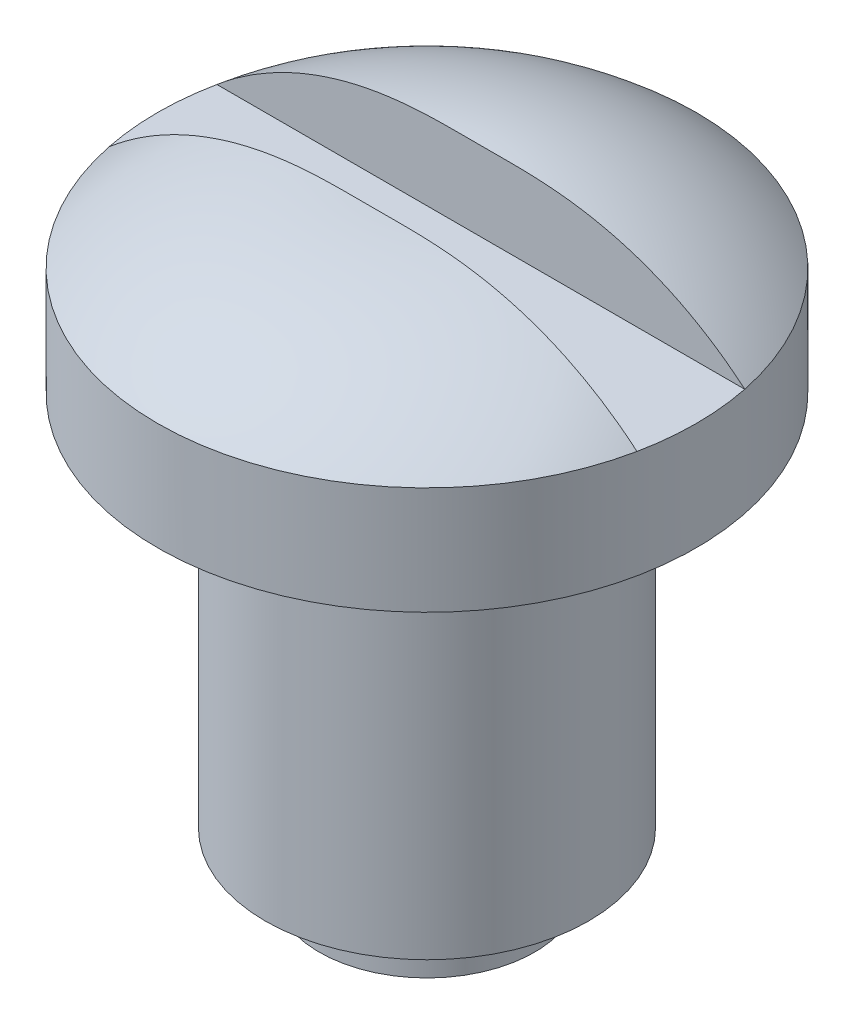
ISO-10303-21;
HEADER;
FILE_DESCRIPTION(('STEP AP214'),'2;1');
FILE_NAME('part.step','',(''),(''),'','','');
FILE_SCHEMA(('AUTOMOTIVE_DESIGN { 1 0 10303 214 1 1 1 1 }'));
ENDSEC;
DATA;
#1=APPLICATION_CONTEXT('core data for automotive mechanical design processes');
#2=APPLICATION_PROTOCOL_DEFINITION('international standard','automotive_design',2000,#1);
#3=PRODUCT_CONTEXT('',#1,'mechanical');
#4=PRODUCT('Part','Part','',(#3));
#5=PRODUCT_RELATED_PRODUCT_CATEGORY('part','',(#4));
#6=PRODUCT_DEFINITION_FORMATION('','',#4);
#7=PRODUCT_DEFINITION_CONTEXT('part definition',#1,'design');
#8=PRODUCT_DEFINITION('design','',#6,#7);
#9=PRODUCT_DEFINITION_SHAPE('','',#8);
#10=(LENGTH_UNIT() NAMED_UNIT(*) SI_UNIT(.MILLI.,.METRE.));
#11=(NAMED_UNIT(*) PLANE_ANGLE_UNIT() SI_UNIT($,.RADIAN.));
#12=(NAMED_UNIT(*) SI_UNIT($,.STERADIAN.) SOLID_ANGLE_UNIT());
#13=UNCERTAINTY_MEASURE_WITH_UNIT(LENGTH_MEASURE(1.E-05),#10,'distance_accuracy_value','');
#14=(GEOMETRIC_REPRESENTATION_CONTEXT(3) GLOBAL_UNCERTAINTY_ASSIGNED_CONTEXT((#13)) GLOBAL_UNIT_ASSIGNED_CONTEXT((#10,
#11,#12)) REPRESENTATION_CONTEXT('',''));
#15=CARTESIAN_POINT('',(0.,0.,0.));
#16=DIRECTION('',(0.,0.,1.));
#17=DIRECTION('',(1.,0.,0.));
#18=AXIS2_PLACEMENT_3D('',#15,#16,#17);
#19=CARTESIAN_POINT('',(0.,1.10246466043971,0.));
#20=DIRECTION('',(0.,1.,0.));
#21=DIRECTION('',(-1.,0.,0.));
#22=AXIS2_PLACEMENT_3D('',#19,#20,#21);
#23=DEGENERATE_TOROIDAL_SURFACE('',#22,1.06727044373896,6.,.T.);
#24=CARTESIAN_POINT('',(0.,5.63387042877594,0.));
#25=DIRECTION('',(0.,1.,0.));
#26=DIRECTION('',(-1.,0.,0.));
#27=AXIS2_PLACEMENT_3D('',#24,#25,#26);
#28=CIRCLE('',#27,5.);
#29=CARTESIAN_POINT('',(-4.89897948556636,5.63387042877594,1.));
#30=VERTEX_POINT('',#29);
#31=CARTESIAN_POINT('',(4.89897948556636,5.63387042877594,1.));
#32=VERTEX_POINT('',#31);
#33=EDGE_CURVE('E72',#30,#32,#28,.T.);
#34=ORIENTED_EDGE('',*,*,#33,.T.);
#35=CARTESIAN_POINT('',(0.,7.1020875392046,1.));
#36=CARTESIAN_POINT('',(0.0834064557707305,7.10208272184523,1.));
#37=CARTESIAN_POINT('',(0.166813050562348,7.10223281939137,1.));
#38=CARTESIAN_POINT('',(0.333613790474369,7.10247516006334,1.));
#39=CARTESIAN_POINT('',(0.417007935582582,7.1025674118777,1.));
#40=CARTESIAN_POINT('',(0.583694002555676,7.10192975363839,1.));
#41=CARTESIAN_POINT('',(0.666985924864176,7.10120084765964,1.));
#42=CARTESIAN_POINT('',(0.83354295706955,7.09815249309468,1.));
#43=CARTESIAN_POINT('',(0.916808067495282,7.09583307808283,1.));
#44=CARTESIAN_POINT('',(1.08441095459764,7.08896792534127,1.));
#45=CARTESIAN_POINT('',(1.16874756320231,7.0843917064364,1.));
#46=CARTESIAN_POINT('',(1.33723448548417,7.07258642105396,1.));
#47=CARTESIAN_POINT('',(1.42138479712311,7.06535732569473,1.));
#48=CARTESIAN_POINT('',(1.67338135985405,7.03925953198136,1.));
#49=CARTESIAN_POINT('',(1.84080316048928,7.01597932970922,1.));
#50=CARTESIAN_POINT('',(2.17342793448257,6.95653075919735,1.));
#51=CARTESIAN_POINT('',(2.33862992810946,6.92035688233348,1.));
#52=CARTESIAN_POINT('',(2.66562199457182,6.83480020021067,1.));
#53=CARTESIAN_POINT('',(2.82741133997188,6.78541460885244,1.));
#54=CARTESIAN_POINT('',(3.16933319106205,6.66541270211304,1.));
#55=CARTESIAN_POINT('',(3.34875748783476,6.59276452487831,1.));
#56=CARTESIAN_POINT('',(3.69986381140192,6.43065319791297,1.));
#57=CARTESIAN_POINT('',(3.8715449975273,6.34118822780715,1.));
#58=CARTESIAN_POINT('',(4.20570500899139,6.14603401854488,1.));
#59=CARTESIAN_POINT('',(4.36817253892713,6.04032543018806,1.));
#60=CARTESIAN_POINT('',(4.68210108491048,5.81368729626758,1.));
#61=CARTESIAN_POINT('',(4.83356349953238,5.69275969015315,1.));
#62=CARTESIAN_POINT('',(5.10616780067026,5.45252945787583,1.));
#63=CARTESIAN_POINT('',(5.22874827866797,5.33485386926348,1.));
#64=CARTESIAN_POINT('',(5.46347008819724,5.08943253022652,1.));
#65=CARTESIAN_POINT('',(5.57560802871921,4.9616835333579,1.));
#66=CARTESIAN_POINT('',(5.78842770053341,4.69723985008136,1.));
#67=CARTESIAN_POINT('',(5.88912354524845,4.56055651917853,1.));
#68=CARTESIAN_POINT('',(6.07851158361741,4.27903802092303,1.));
#69=CARTESIAN_POINT('',(6.16719937706766,4.13419989272224,1.));
#70=CARTESIAN_POINT('',(6.33081368530602,3.83937678695172,1.));
#71=CARTESIAN_POINT('',(6.40590202756893,3.68948158409317,1.));
#72=CARTESIAN_POINT('',(6.54318132174574,3.38383038134429,1.));
#73=CARTESIAN_POINT('',(6.60536754854852,3.22807225887593,1.));
#74=CARTESIAN_POINT('',(6.71634631953301,2.91189329747483,1.));
#75=CARTESIAN_POINT('',(6.7651417494366,2.75147347139462,1.));
#76=CARTESIAN_POINT('',(6.84901991932449,2.42702477233666,1.));
#77=CARTESIAN_POINT('',(6.88409761224459,2.26299459443058,1.));
#78=CARTESIAN_POINT('',(6.94017279887664,1.93307682401257,1.));
#79=CARTESIAN_POINT('',(6.96121427538016,1.76719670540409,1.));
#80=CARTESIAN_POINT('',(6.98924738394379,1.43419529162845,1.));
#81=CARTESIAN_POINT('',(6.99623413827782,1.26707358575478,1.));
#82=CARTESIAN_POINT('',(6.99609292276324,0.932849560999366,1.));
#83=CARTESIAN_POINT('',(6.98896608053519,0.765747241635463,1.));
#84=CARTESIAN_POINT('',(6.96065113952161,0.432738195285757,1.));
#85=CARTESIAN_POINT('',(6.93946304055133,0.266831468315663,1.));
#86=CARTESIAN_POINT('',(6.88318477051579,-0.0625647472183489,1.));
#87=CARTESIAN_POINT('',(6.84809804036746,-0.226054823693966,1.));
#88=CARTESIAN_POINT('',(6.76428897225685,-0.549441028176385,1.));
#89=CARTESIAN_POINT('',(6.71557137885631,-0.709338385834929,1.));
#90=CARTESIAN_POINT('',(6.60485390002731,-1.02443776890092,1.));
#91=CARTESIAN_POINT('',(6.54285612977677,-1.17964053754397,1.));
#92=CARTESIAN_POINT('',(6.40604361249863,-1.48422157046659,1.));
#93=CARTESIAN_POINT('',(6.33123356972273,-1.63360194791474,1.));
#94=CARTESIAN_POINT('',(6.16929054873599,-1.92559053577235,1.));
#95=CARTESIAN_POINT('',(6.08215354261695,-2.06819651217959,1.));
#96=CARTESIAN_POINT('',(5.89623430250709,-2.34552770586269,1.));
#97=CARTESIAN_POINT('',(5.79745633021479,-2.48025578033902,1.));
#98=CARTESIAN_POINT('',(5.58872910101907,-2.74120347756172,1.));
#99=CARTESIAN_POINT('',(5.47875790939337,-2.86740555518401,1.));
#100=CARTESIAN_POINT('',(5.24864242949182,-3.11007850417937,1.));
#101=CARTESIAN_POINT('',(5.12850183316016,-3.2265528768897,1.));
#102=CARTESIAN_POINT('',(4.87837411943098,-3.44946461086788,1.));
#103=CARTESIAN_POINT('',(4.74834930097376,-3.55585966746264,1.));
#104=CARTESIAN_POINT('',(4.47987162785239,-3.75731533967046,1.));
#105=CARTESIAN_POINT('',(4.34142182210249,-3.85238001921165,1.));
#106=CARTESIAN_POINT('',(4.05764920166803,-4.03021798407122,1.));
#107=CARTESIAN_POINT('',(3.91235750104673,-4.11304093749308,1.));
#108=CARTESIAN_POINT('',(3.61539683554561,-4.26636412587088,1.));
#109=CARTESIAN_POINT('',(3.46372731388388,-4.33686328218079,1.));
#110=CARTESIAN_POINT('',(3.15403351286376,-4.46560231188326,1.));
#111=CARTESIAN_POINT('',(2.99597217434372,-4.5237528918419,1.));
#112=CARTESIAN_POINT('',(2.67564457785104,-4.6269514505552,1.));
#113=CARTESIAN_POINT('',(2.51337900049744,-4.67200153587602,1.));
#114=CARTESIAN_POINT('',(2.26715039194015,-4.72993435895696,1.));
#115=CARTESIAN_POINT('',(2.1843000510808,-4.74768438701457,1.));
#116=CARTESIAN_POINT('',(2.01795983952187,-4.77993587778114,1.));
#117=CARTESIAN_POINT('',(1.934469930054,-4.79443714192443,1.));
#118=CARTESIAN_POINT('',(1.76701964127145,-4.82027148628442,1.));
#119=CARTESIAN_POINT('',(1.6830593472316,-4.8316051229305,1.));
#120=CARTESIAN_POINT('',(1.51480145225322,-4.85125141917102,1.));
#121=CARTESIAN_POINT('',(1.43050390808286,-4.8595645672124,1.));
#122=CARTESIAN_POINT('',(1.27294174447047,-4.87248256916165,1.));
#123=CARTESIAN_POINT('',(1.19970495904461,-4.87743410785132,1.));
#124=CARTESIAN_POINT('',(1.0531286526334,-4.88547504648556,1.));
#125=CARTESIAN_POINT('',(0.979789128254282,-4.88856438338931,1.));
#126=CARTESIAN_POINT('',(0.833034316076206,-4.89320828077426,1.));
#127=CARTESIAN_POINT('',(0.75961900956049,-4.8947622132264,1.));
#128=CARTESIAN_POINT('',(0.612775101066562,-4.89677848687765,1.));
#129=CARTESIAN_POINT('',(0.539346498954059,-4.89724081635609,1.));
#130=CARTESIAN_POINT('',(0.392309412918296,-4.89761500465705,1.));
#131=CARTESIAN_POINT('',(0.318700928954407,-4.89752551231366,1.));
#132=CARTESIAN_POINT('',(0.17148546994651,-4.89730862061728,1.));
#133=CARTESIAN_POINT('',(0.0978784949004949,-4.89718122198718,1.));
#134=CARTESIAN_POINT('',(-0.0493310835012094,-4.89714180580704,1.));
#135=CARTESIAN_POINT('',(-0.122933686850261,-4.89722977514643,1.));
#136=CARTESIAN_POINT('',(-0.270140262042322,-4.89745465383858,1.));
#137=CARTESIAN_POINT('',(-0.343744233881473,-4.89759156422296,1.));
#138=CARTESIAN_POINT('',(-0.490561297694793,-4.89743511265031,1.));
#139=CARTESIAN_POINT('',(-0.56377438628018,-4.89714403553991,1.));
#140=CARTESIAN_POINT('',(-0.710190888463883,-4.89559111328247,1.));
#141=CARTESIAN_POINT('',(-0.783394302227771,-4.89432928774678,1.));
#142=CARTESIAN_POINT('',(-0.929751396771713,-4.89036714999057,1.));
#143=CARTESIAN_POINT('',(-1.00290508447176,-4.88766711870483,1.));
#144=CARTESIAN_POINT('',(-1.14912429872804,-4.88048258089455,1.));
#145=CARTESIAN_POINT('',(-1.22218982508005,-4.87599807024397,1.));
#146=CARTESIAN_POINT('',(-1.44062673318779,-4.85951745518037,1.));
#147=CARTESIAN_POINT('',(-1.58578936109009,-4.84448356362797,1.));
#148=CARTESIAN_POINT('',(-1.87486995170644,-4.80517164457572,1.));
#149=CARTESIAN_POINT('',(-2.0187878654679,-4.78089325518035,1.));
#150=CARTESIAN_POINT('',(-2.32917386464546,-4.71763440542215,1.));
#151=CARTESIAN_POINT('',(-2.49527917156747,-4.67684729223116,1.));
#152=CARTESIAN_POINT('',(-2.82384520194434,-4.5816680739705,1.));
#153=CARTESIAN_POINT('',(-2.98629949024427,-4.52725373014414,1.));
#154=CARTESIAN_POINT('',(-3.30575196462401,-4.40511624910536,1.));
#155=CARTESIAN_POINT('',(-3.4627606216932,-4.33742053517782,1.));
#156=CARTESIAN_POINT('',(-3.7703980381138,-4.18904230973254,1.));
#157=CARTESIAN_POINT('',(-3.92103074565678,-4.10836798810111,1.));
#158=CARTESIAN_POINT('',(-4.21511935605219,-3.93437103186997,1.));
#159=CARTESIAN_POINT('',(-4.35856391457772,-3.84102921601775,1.));
#160=CARTESIAN_POINT('',(-4.63698130530766,-3.64240179292858,1.));
#161=CARTESIAN_POINT('',(-4.77195221036444,-3.5371134838974,1.));
#162=CARTESIAN_POINT('',(-5.03257220401592,-3.31518174362788,1.));
#163=CARTESIAN_POINT('',(-5.1582065979867,-3.19852105376033,1.));
#164=CARTESIAN_POINT('',(-5.39896529121806,-2.95483370618898,1.));
#165=CARTESIAN_POINT('',(-5.51409045593652,-2.82780790370936,1.));
#166=CARTESIAN_POINT('',(-5.73102510458367,-2.56665778769994,1.));
#167=CARTESIAN_POINT('',(-5.83303495429258,-2.43269985136781,1.));
#168=CARTESIAN_POINT('',(-6.0253807455025,-2.15657562376302,1.));
#169=CARTESIAN_POINT('',(-6.11571241229456,-2.01440635418919,1.));
#170=CARTESIAN_POINT('',(-6.28390605517976,-1.72308334813499,1.));
#171=CARTESIAN_POINT('',(-6.36178168710172,-1.57393749542023,1.));
#172=CARTESIAN_POINT('',(-6.50464397034856,-1.26952784800976,1.));
#173=CARTESIAN_POINT('',(-6.56962586781361,-1.11426182203103,1.));
#174=CARTESIAN_POINT('',(-6.6858673404774,-0.79965800263614,1.));
#175=CARTESIAN_POINT('',(-6.73720125260953,-0.640347670225266,1.));
#176=CARTESIAN_POINT('',(-6.82626732910097,-0.317905542591905,1.));
#177=CARTESIAN_POINT('',(-6.86399447799251,-0.154772361811058,1.));
#178=CARTESIAN_POINT('',(-6.92554315212827,0.174065520642543,1.));
#179=CARTESIAN_POINT('',(-6.949367216622,0.339769747062371,1.));
#180=CARTESIAN_POINT('',(-6.9829552816151,0.67265994615952,1.));
#181=CARTESIAN_POINT('',(-6.99271401940733,0.83984644991974,1.));
#182=CARTESIAN_POINT('',(-6.99807886683044,1.17410496901916,1.));
#183=CARTESIAN_POINT('',(-6.99371379607232,1.34117652259928,1.));
#184=CARTESIAN_POINT('',(-6.97092034505352,1.6744336382895,1.));
#185=CARTESIAN_POINT('',(-6.95248560194383,1.84061876527248,1.));
#186=CARTESIAN_POINT('',(-6.90167583741585,2.1708556014794,1.));
#187=CARTESIAN_POINT('',(-6.86929987016396,2.33490716517498,1.));
#188=CARTESIAN_POINT('',(-6.79085777712036,2.65962525802465,1.));
#189=CARTESIAN_POINT('',(-6.74479784905352,2.82029328444316,1.));
#190=CARTESIAN_POINT('',(-6.63928555472313,3.13726249047386,1.));
#191=CARTESIAN_POINT('',(-6.57982626132004,3.29356136419568,1.));
#192=CARTESIAN_POINT('',(-6.44798044434751,3.60053879799335,1.));
#193=CARTESIAN_POINT('',(-6.37559875176592,3.75121943306472,1.));
#194=CARTESIAN_POINT('',(-6.21842151048038,4.045938753312,1.));
#195=CARTESIAN_POINT('',(-6.13362735963036,4.18997818400171,1.));
#196=CARTESIAN_POINT('',(-5.95226097395288,4.47036513655283,1.));
#197=CARTESIAN_POINT('',(-5.85569306515447,4.6067154568514,1.));
#198=CARTESIAN_POINT('',(-5.65134664421551,4.87095337844092,1.));
#199=CARTESIAN_POINT('',(-5.54355722294981,4.99883254305611,1.));
#200=CARTESIAN_POINT('',(-5.3176619547604,5.24504244332802,1.));
#201=CARTESIAN_POINT('',(-5.19955986168378,5.36337662346663,1.));
#202=CARTESIAN_POINT('',(-4.95361897679406,5.58994555321354,1.));
#203=CARTESIAN_POINT('',(-4.82576204522577,5.69816061131528,1.));
#204=CARTESIAN_POINT('',(-4.56147871986629,5.90345964245239,1.));
#205=CARTESIAN_POINT('',(-4.42505539380045,6.00054756545111,1.));
#206=CARTESIAN_POINT('',(-4.14380029213791,6.18349990783393,1.));
#207=CARTESIAN_POINT('',(-3.99892603385962,6.26929901416298,1.));
#208=CARTESIAN_POINT('',(-3.7025208194815,6.42849051361529,1.));
#209=CARTESIAN_POINT('',(-3.55098996434505,6.5018830948317,1.));
#210=CARTESIAN_POINT('',(-3.24302109338905,6.63556426822048,1.));
#211=CARTESIAN_POINT('',(-3.08660668407954,6.69590725499664,1.));
#212=CARTESIAN_POINT('',(-2.76938749628865,6.80364919736307,1.));
#213=CARTESIAN_POINT('',(-2.60858236458466,6.85104710815964,1.));
#214=CARTESIAN_POINT('',(-2.24752685598251,6.94196789974219,1.));
#215=CARTESIAN_POINT('',(-2.04645869514569,6.98228370784214,1.));
#216=CARTESIAN_POINT('',(-1.74283926362059,7.02882872972167,1.));
#217=CARTESIAN_POINT('',(-1.6412878025781,7.04202282208212,1.));
#218=CARTESIAN_POINT('',(-1.43771442273999,7.06406666620214,1.));
#219=CARTESIAN_POINT('',(-1.33569252883355,7.07291664519285,1.));
#220=CARTESIAN_POINT('',(-1.13095848454759,7.08676981909807,1.));
#221=CARTESIAN_POINT('',(-1.02824525151414,7.09175632887864,1.));
#222=CARTESIAN_POINT('',(-0.822716521390734,7.09863351236529,1.));
#223=CARTESIAN_POINT('',(-0.719901016563188,7.10052393063437,1.));
#224=CARTESIAN_POINT('',(-0.51423519360891,7.10246869540313,1.));
#225=CARTESIAN_POINT('',(-0.411384873318856,7.10252257063907,1.));
#226=CARTESIAN_POINT('',(-0.205689772517381,7.10233495692986,1.));
#227=CARTESIAN_POINT('',(-0.102844991944583,7.1020934792878,1.));
#228=CARTESIAN_POINT('',(0.,7.1020875392046,1.));
#229=B_SPLINE_CURVE_WITH_KNOTS('',3,(#35,#36,#37,#38,#39,#40,#41,#42,#43,#44,#45,#46,#47,#48,
#49,#50,#51,#52,#53,#54,#55,#56,#57,#58,#59,#60,#61,#62,#63,#64,#65,#66,#67,#68,#69,#70,#71,#72,
#73,#74,#75,#76,#77,#78,#79,#80,#81,#82,#83,#84,#85,#86,#87,#88,#89,#90,#91,#92,#93,#94,#95,#96,
#97,#98,#99,#100,#101,#102,#103,#104,#105,#106,#107,#108,#109,#110,#111,#112,#113,#114,#115,
#116,#117,#118,#119,#120,#121,#122,#123,#124,#125,#126,#127,#128,#129,#130,#131,#132,#133,#134,
#135,#136,#137,#138,#139,#140,#141,#142,#143,#144,#145,#146,#147,#148,#149,#150,#151,#152,#153,
#154,#155,#156,#157,#158,#159,#160,#161,#162,#163,#164,#165,#166,#167,#168,#169,#170,#171,#172,
#173,#174,#175,#176,#177,#178,#179,#180,#181,#182,#183,#184,#185,#186,#187,#188,#189,#190,#191,
#192,#193,#194,#195,#196,#197,#198,#199,#200,#201,#202,#203,#204,#205,#206,#207,#208,#209,#210,
#211,#212,#213,#214,#215,#216,#217,#218,#219,#220,#221,#222,#223,#224,#225,#226,#227,#228),
.UNSPECIFIED.,.T.,.F.,(4,2,2,2,2,2,2,2,2,2,2,2,2,2,2,2,2,2,2,2,2,2,2,2,2,2,2,2,2,2,2,2,2,2,2,2,
2,2,2,2,2,2,2,2,2,2,2,2,2,2,2,2,2,2,2,2,2,2,2,2,2,2,2,2,2,2,2,2,2,2,2,2,2,2,2,2,2,2,2,2,2,2,2,2,
2,2,2,2,2,2,2,2,2,2,2,2,4),(0.,0.25021982780834,0.500402063149061,0.7502787185956,
1.00015009951085,1.25349277668957,1.5068382120719,2.0134394518421,2.52025738914066,
3.02718228906713,3.60701025628497,4.1869010245933,4.76748798445208,5.34800103146572,
5.85716473944914,6.36649321598098,6.87518647307086,7.38406563299907,7.88642167379757,
8.38896136776653,8.8913926790426,9.39400867258204,9.89504221551941,10.3962496134083,
10.8974169684237,11.3985843300241,11.8996276939058,12.4004968736534,12.9012863375402,
13.4018923204102,13.9026622587009,14.4032494338611,14.9048371917941,15.4062436258272,
15.9096690771316,16.4129134151982,16.914056333074,17.4152430917773,17.919939065653,
18.4245538392277,18.6786916565942,18.9328450027236,19.1869536758594,19.4410212384593,
19.6612071864842,19.8814005880099,20.1016840183727,20.3219698139328,20.5427952051389,
20.7636163852852,20.9844241232322,21.2052365158159,21.4248743550261,21.6445077571629,
21.8640982724971,22.0836892955691,22.5212203689935,22.9587685722623,23.4713103028264,
23.9846939818503,24.4970285788864,25.0090411366534,25.5218378244031,26.0347507172241,
26.548454492966,27.0621159258478,27.5666440512835,28.0713563355915,28.5755114427125,
29.0798520854846,29.581386668168,30.0831059285651,30.5847335266097,31.0865487658293,
31.5873406980163,32.0883592419449,32.589411782519,33.0902377319857,33.5913231924428,
34.0922217148603,34.5930638709208,35.0937225541365,35.5948725859664,36.0958409519422,
36.597764738314,37.0995097938755,37.6040408421131,38.1085642405577,38.6109422703299,
39.113360834927,39.7275350409815,40.0346747686854,40.3417984288636,40.6502411805076,
40.9587093783398,41.267256729661,41.5757922733131),.UNSPECIFIED.);
#230=EDGE_CURVE('E80',#30,#32,#229,.T.);
#231=ORIENTED_EDGE('',*,*,#230,.F.);
#232=EDGE_LOOP('',(#34,#231));
#233=FACE_BOUND('',#232,.T.);
#234=ADVANCED_FACE('F38',(#233),#23,.T.);
#235=CARTESIAN_POINT('',(0.,6.1020875392046,0.));
#236=DIRECTION('',(0.,1.,0.));
#237=DIRECTION('',(-1.,0.,0.));
#238=AXIS2_PLACEMENT_3D('',#235,#236,#237);
#239=CYLINDRICAL_SURFACE('',#238,3.);
#240=CARTESIAN_POINT('',(0.,-3.36612957122406,0.));
#241=DIRECTION('',(0.,1.,0.));
#242=DIRECTION('',(-1.,0.,0.));
#243=AXIS2_PLACEMENT_3D('',#240,#241,#242);
#244=CIRCLE('',#243,3.);
#245=CARTESIAN_POINT('',(-3.,-3.36612957122406,0.));
#246=VERTEX_POINT('',#245);
#247=EDGE_CURVE('E141',#246,#246,#244,.T.);
#248=ORIENTED_EDGE('',*,*,#247,.T.);
#249=EDGE_LOOP('',(#248));
#250=FACE_BOUND('',#249,.T.);
#251=CARTESIAN_POINT('',(0.,3.63387042877594,0.));
#252=DIRECTION('',(0.,1.,0.));
#253=DIRECTION('',(-1.,0.,0.));
#254=AXIS2_PLACEMENT_3D('',#251,#252,#253);
#255=CIRCLE('',#254,3.);
#256=CARTESIAN_POINT('',(-3.,3.63387042877594,0.));
#257=VERTEX_POINT('',#256);
#258=EDGE_CURVE('E11',#257,#257,#255,.T.);
#259=ORIENTED_EDGE('',*,*,#258,.F.);
#260=EDGE_LOOP('',(#259));
#261=FACE_BOUND('',#260,.T.);
#262=ADVANCED_FACE('F40',(#250,#261),#239,.T.);
#263=CARTESIAN_POINT('',(-3.,3.63387042877594,0.));
#264=DIRECTION('',(0.,-1.,0.));
#265=DIRECTION('',(1.,0.,0.));
#266=AXIS2_PLACEMENT_3D('',#263,#264,#265);
#267=PLANE('',#266);
#268=ORIENTED_EDGE('',*,*,#258,.T.);
#269=EDGE_LOOP('',(#268));
#270=FACE_BOUND('',#269,.T.);
#271=CARTESIAN_POINT('',(0.,3.63387042877593,0.));
#272=DIRECTION('',(0.,1.,0.));
#273=DIRECTION('',(-1.,0.,0.));
#274=AXIS2_PLACEMENT_3D('',#271,#272,#273);
#275=CIRCLE('',#274,5.);
#276=CARTESIAN_POINT('',(-5.,3.63387042877594,0.));
#277=VERTEX_POINT('',#276);
#278=EDGE_CURVE('E46',#277,#277,#275,.T.);
#279=ORIENTED_EDGE('',*,*,#278,.F.);
#280=EDGE_LOOP('',(#279));
#281=FACE_BOUND('',#280,.T.);
#282=ADVANCED_FACE('F95',(#270,#281),#267,.T.);
#283=CARTESIAN_POINT('',(0.,6.1020875392046,0.));
#284=DIRECTION('',(0.,1.,0.));
#285=DIRECTION('',(-1.,0.,0.));
#286=AXIS2_PLACEMENT_3D('',#283,#284,#285);
#287=CYLINDRICAL_SURFACE('',#286,5.);
#288=ORIENTED_EDGE('',*,*,#278,.T.);
#289=EDGE_LOOP('',(#288));
#290=FACE_BOUND('',#289,.T.);
#291=CARTESIAN_POINT('',(-4.89897948556636,5.63387042877594,-1.));
#292=VERTEX_POINT('',#291);
#293=EDGE_CURVE('E58',#292,#30,#28,.T.);
#294=ORIENTED_EDGE('',*,*,#293,.F.);
#295=CARTESIAN_POINT('',(4.89897948556636,5.63387042877593,-1.));
#296=VERTEX_POINT('',#295);
#297=EDGE_CURVE('E70',#296,#292,#28,.T.);
#298=ORIENTED_EDGE('',*,*,#297,.F.);
#299=EDGE_CURVE('E53',#32,#296,#28,.T.);
#300=ORIENTED_EDGE('',*,*,#299,.F.);
#301=ORIENTED_EDGE('',*,*,#33,.F.);
#302=EDGE_LOOP('',(#294,#298,#300,#301));
#303=FACE_BOUND('',#302,.T.);
#304=ADVANCED_FACE('F68',(#290,#303),#287,.T.);
#305=ORIENTED_EDGE('',*,*,#297,.T.);
#306=CARTESIAN_POINT('',(0.,7.1020875392046,-1.));
#307=CARTESIAN_POINT('',(-0.0834064557707321,7.10208272184523,-1.));
#308=CARTESIAN_POINT('',(-0.166813050562349,7.10223281939137,-1.));
#309=CARTESIAN_POINT('',(-0.333613790474371,7.10247516006334,-1.));
#310=CARTESIAN_POINT('',(-0.417007935582584,7.1025674118777,-1.));
#311=CARTESIAN_POINT('',(-0.583694002555678,7.10192975363839,-1.));
#312=CARTESIAN_POINT('',(-0.666985924864178,7.10120084765964,-1.));
#313=CARTESIAN_POINT('',(-0.833542957069552,7.09815249309468,-1.));
#314=CARTESIAN_POINT('',(-0.916808067495284,7.09583307808283,-1.));
#315=CARTESIAN_POINT('',(-1.08441095459764,7.08896792534127,-1.));
#316=CARTESIAN_POINT('',(-1.16874756320232,7.0843917064364,-1.));
#317=CARTESIAN_POINT('',(-1.33723448548417,7.07258642105395,-1.));
#318=CARTESIAN_POINT('',(-1.42138479712312,7.06535732569473,-1.));
#319=CARTESIAN_POINT('',(-1.67338135985405,7.03925953198136,-1.));
#320=CARTESIAN_POINT('',(-1.84080316048928,7.01597932970921,-1.));
#321=CARTESIAN_POINT('',(-2.17342793448257,6.95653075919735,-1.));
#322=CARTESIAN_POINT('',(-2.33862992810946,6.92035688233348,-1.));
#323=CARTESIAN_POINT('',(-2.66562199457182,6.83480020021067,-1.));
#324=CARTESIAN_POINT('',(-2.82741133997188,6.78541460885243,-1.));
#325=CARTESIAN_POINT('',(-3.16933319106205,6.66541270211304,-1.));
#326=CARTESIAN_POINT('',(-3.34875748783476,6.59276452487831,-1.));
#327=CARTESIAN_POINT('',(-3.69986381140192,6.43065319791297,-1.));
#328=CARTESIAN_POINT('',(-3.8715449975273,6.34118822780715,-1.));
#329=CARTESIAN_POINT('',(-4.20570500899139,6.14603401854488,-1.));
#330=CARTESIAN_POINT('',(-4.36817253892713,6.04032543018806,-1.));
#331=CARTESIAN_POINT('',(-4.68210108491048,5.81368729626758,-1.));
#332=CARTESIAN_POINT('',(-4.83356349953238,5.69275969015315,-1.));
#333=CARTESIAN_POINT('',(-5.10616780067026,5.45252945787583,-1.));
#334=CARTESIAN_POINT('',(-5.22874827866798,5.33485386926348,-1.));
#335=CARTESIAN_POINT('',(-5.46347008819724,5.08943253022652,-1.));
#336=CARTESIAN_POINT('',(-5.57560802871921,4.9616835333579,-1.));
#337=CARTESIAN_POINT('',(-5.78842770053341,4.69723985008135,-1.));
#338=CARTESIAN_POINT('',(-5.88912354524846,4.56055651917853,-1.));
#339=CARTESIAN_POINT('',(-6.07851158361741,4.27903802092303,-1.));
#340=CARTESIAN_POINT('',(-6.16719937706766,4.13419989272224,-1.));
#341=CARTESIAN_POINT('',(-6.33081368530602,3.83937678695171,-1.));
#342=CARTESIAN_POINT('',(-6.40590202756893,3.68948158409317,-1.));
#343=CARTESIAN_POINT('',(-6.54318132174574,3.38383038134429,-1.));
#344=CARTESIAN_POINT('',(-6.60536754854852,3.22807225887593,-1.));
#345=CARTESIAN_POINT('',(-6.71634631953301,2.91189329747483,-1.));
#346=CARTESIAN_POINT('',(-6.7651417494366,2.75147347139462,-1.));
#347=CARTESIAN_POINT('',(-6.84901991932449,2.42702477233666,-1.));
#348=CARTESIAN_POINT('',(-6.88409761224459,2.26299459443058,-1.));
#349=CARTESIAN_POINT('',(-6.94017279887664,1.93307682401258,-1.));
#350=CARTESIAN_POINT('',(-6.96121427538016,1.76719670540409,-1.));
#351=CARTESIAN_POINT('',(-6.98924738394378,1.43419529162845,-1.));
#352=CARTESIAN_POINT('',(-6.99623413827782,1.26707358575478,-1.));
#353=CARTESIAN_POINT('',(-6.99609292276324,0.932849560999366,-1.));
#354=CARTESIAN_POINT('',(-6.98896608053519,0.765747241635462,-1.));
#355=CARTESIAN_POINT('',(-6.96065113952161,0.432738195285756,-1.));
#356=CARTESIAN_POINT('',(-6.93946304055133,0.266831468315662,-1.));
#357=CARTESIAN_POINT('',(-6.88318477051579,-0.0625647472183491,-1.));
#358=CARTESIAN_POINT('',(-6.84809804036746,-0.226054823693967,-1.));
#359=CARTESIAN_POINT('',(-6.76428897225684,-0.549441028176385,-1.));
#360=CARTESIAN_POINT('',(-6.7155713788563,-0.709338385834929,-1.));
#361=CARTESIAN_POINT('',(-6.60485390002731,-1.02443776890092,-1.));
#362=CARTESIAN_POINT('',(-6.54285612977677,-1.17964053754397,-1.));
#363=CARTESIAN_POINT('',(-6.40604361249863,-1.48422157046659,-1.));
#364=CARTESIAN_POINT('',(-6.33123356972273,-1.63360194791474,-1.));
#365=CARTESIAN_POINT('',(-6.16929054873599,-1.92559053577235,-1.));
#366=CARTESIAN_POINT('',(-6.08215354261695,-2.06819651217959,-1.));
#367=CARTESIAN_POINT('',(-5.89623430250708,-2.34552770586269,-1.));
#368=CARTESIAN_POINT('',(-5.79745633021479,-2.48025578033902,-0.999999999999999));
#369=CARTESIAN_POINT('',(-5.58872910101907,-2.74120347756172,-0.999999999999999));
#370=CARTESIAN_POINT('',(-5.47875790939337,-2.86740555518401,-0.999999999999999));
#371=CARTESIAN_POINT('',(-5.24864242949182,-3.11007850417937,-0.999999999999999));
#372=CARTESIAN_POINT('',(-5.12850183316016,-3.2265528768897,-0.999999999999999));
#373=CARTESIAN_POINT('',(-4.87837411943098,-3.44946461086788,-0.999999999999999));
#374=CARTESIAN_POINT('',(-4.74834930097377,-3.55585966746265,-0.999999999999999));
#375=CARTESIAN_POINT('',(-4.47987162785239,-3.75731533967046,-0.999999999999999));
#376=CARTESIAN_POINT('',(-4.34142182210249,-3.85238001921165,-0.999999999999999));
#377=CARTESIAN_POINT('',(-4.05764920166802,-4.03021798407122,-0.999999999999999));
#378=CARTESIAN_POINT('',(-3.91235750104673,-4.11304093749308,-0.999999999999999));
#379=CARTESIAN_POINT('',(-3.61539683554561,-4.26636412587088,-0.999999999999999));
#380=CARTESIAN_POINT('',(-3.46372731388388,-4.33686328218079,-0.999999999999999));
#381=CARTESIAN_POINT('',(-3.15403351286376,-4.46560231188326,-0.999999999999999));
#382=CARTESIAN_POINT('',(-2.99597217434372,-4.5237528918419,-0.999999999999999));
#383=CARTESIAN_POINT('',(-2.67564457785104,-4.6269514505552,-0.999999999999999));
#384=CARTESIAN_POINT('',(-2.51337900049744,-4.67200153587602,-0.999999999999999));
#385=CARTESIAN_POINT('',(-2.26715039194015,-4.72993435895696,-0.999999999999999));
#386=CARTESIAN_POINT('',(-2.18430005108079,-4.74768438701457,-0.999999999999999));
#387=CARTESIAN_POINT('',(-2.01795983952187,-4.77993587778114,-0.999999999999999));
#388=CARTESIAN_POINT('',(-1.934469930054,-4.79443714192443,-0.999999999999999));
#389=CARTESIAN_POINT('',(-1.76701964127145,-4.82027148628442,-0.999999999999999));
#390=CARTESIAN_POINT('',(-1.6830593472316,-4.8316051229305,-0.999999999999999));
#391=CARTESIAN_POINT('',(-1.51480145225322,-4.85125141917102,-0.999999999999999));
#392=CARTESIAN_POINT('',(-1.43050390808286,-4.8595645672124,-0.999999999999999));
#393=CARTESIAN_POINT('',(-1.27294174447047,-4.87248256916165,-0.999999999999999));
#394=CARTESIAN_POINT('',(-1.19970495904461,-4.87743410785132,-0.999999999999999));
#395=CARTESIAN_POINT('',(-1.0531286526334,-4.88547504648556,-0.999999999999999));
#396=CARTESIAN_POINT('',(-0.979789128254282,-4.88856438338931,-0.999999999999999));
#397=CARTESIAN_POINT('',(-0.833034316076205,-4.89320828077426,-0.999999999999999));
#398=CARTESIAN_POINT('',(-0.759619009560489,-4.8947622132264,-0.999999999999999));
#399=CARTESIAN_POINT('',(-0.61277510106656,-4.89677848687765,-0.999999999999999));
#400=CARTESIAN_POINT('',(-0.539346498954057,-4.89724081635609,-0.999999999999999));
#401=CARTESIAN_POINT('',(-0.392309412918295,-4.89761500465705,-0.999999999999999));
#402=CARTESIAN_POINT('',(-0.318700928954406,-4.89752551231366,-0.999999999999999));
#403=CARTESIAN_POINT('',(-0.171485469946509,-4.89730862061728,-0.999999999999999));
#404=CARTESIAN_POINT('',(-0.0978784949004938,-4.89718122198718,-0.999999999999999));
#405=CARTESIAN_POINT('',(0.0493310835012103,-4.89714180580704,-0.999999999999999));
#406=CARTESIAN_POINT('',(0.122933686850262,-4.89722977514643,-0.999999999999999));
#407=CARTESIAN_POINT('',(0.270140262042323,-4.89745465383858,-0.999999999999999));
#408=CARTESIAN_POINT('',(0.343744233881474,-4.89759156422296,-0.999999999999999));
#409=CARTESIAN_POINT('',(0.490561297694792,-4.89743511265031,-0.999999999999999));
#410=CARTESIAN_POINT('',(0.563774386280179,-4.89714403553991,-0.999999999999999));
#411=CARTESIAN_POINT('',(0.710190888463881,-4.89559111328247,-0.999999999999999));
#412=CARTESIAN_POINT('',(0.78339430222777,-4.89432928774678,-0.999999999999999));
#413=CARTESIAN_POINT('',(0.929751396771713,-4.89036714999057,-0.999999999999999));
#414=CARTESIAN_POINT('',(1.00290508447176,-4.88766711870483,-0.999999999999999));
#415=CARTESIAN_POINT('',(1.14912429872804,-4.88048258089455,-0.999999999999999));
#416=CARTESIAN_POINT('',(1.22218982508005,-4.87599807024397,-0.999999999999999));
#417=CARTESIAN_POINT('',(1.44062673318779,-4.85951745518037,-0.999999999999999));
#418=CARTESIAN_POINT('',(1.58578936109009,-4.84448356362797,-0.999999999999999));
#419=CARTESIAN_POINT('',(1.87486995170644,-4.80517164457572,-0.999999999999999));
#420=CARTESIAN_POINT('',(2.0187878654679,-4.78089325518035,-0.999999999999999));
#421=CARTESIAN_POINT('',(2.32917386464546,-4.71763440542215,-0.999999999999999));
#422=CARTESIAN_POINT('',(2.49527917156747,-4.67684729223116,-0.999999999999999));
#423=CARTESIAN_POINT('',(2.82384520194434,-4.5816680739705,-0.999999999999999));
#424=CARTESIAN_POINT('',(2.98629949024427,-4.52725373014414,-0.999999999999999));
#425=CARTESIAN_POINT('',(3.30575196462401,-4.40511624910536,-0.999999999999999));
#426=CARTESIAN_POINT('',(3.4627606216932,-4.33742053517782,-0.999999999999999));
#427=CARTESIAN_POINT('',(3.7703980381138,-4.18904230973255,-0.999999999999999));
#428=CARTESIAN_POINT('',(3.92103074565678,-4.10836798810111,-0.999999999999999));
#429=CARTESIAN_POINT('',(4.21511935605219,-3.93437103186997,-0.999999999999999));
#430=CARTESIAN_POINT('',(4.35856391457772,-3.84102921601775,-0.999999999999999));
#431=CARTESIAN_POINT('',(4.63698130530766,-3.64240179292858,-0.999999999999999));
#432=CARTESIAN_POINT('',(4.77195221036444,-3.5371134838974,-0.999999999999999));
#433=CARTESIAN_POINT('',(5.03257220401592,-3.31518174362788,-0.999999999999999));
#434=CARTESIAN_POINT('',(5.1582065979867,-3.19852105376033,-0.999999999999999));
#435=CARTESIAN_POINT('',(5.39896529121806,-2.95483370618899,-0.999999999999999));
#436=CARTESIAN_POINT('',(5.51409045593652,-2.82780790370936,-0.999999999999999));
#437=CARTESIAN_POINT('',(5.73102510458367,-2.56665778769994,-0.999999999999999));
#438=CARTESIAN_POINT('',(5.83303495429258,-2.43269985136781,-1.));
#439=CARTESIAN_POINT('',(6.0253807455025,-2.15657562376302,-1.));
#440=CARTESIAN_POINT('',(6.11571241229456,-2.01440635418919,-1.));
#441=CARTESIAN_POINT('',(6.28390605517976,-1.72308334813499,-1.));
#442=CARTESIAN_POINT('',(6.36178168710172,-1.57393749542023,-1.));
#443=CARTESIAN_POINT('',(6.50464397034857,-1.26952784800976,-1.));
#444=CARTESIAN_POINT('',(6.56962586781361,-1.11426182203103,-1.));
#445=CARTESIAN_POINT('',(6.6858673404774,-0.799658002636139,-1.));
#446=CARTESIAN_POINT('',(6.73720125260953,-0.640347670225264,-1.));
#447=CARTESIAN_POINT('',(6.82626732910098,-0.317905542591903,-1.));
#448=CARTESIAN_POINT('',(6.86399447799251,-0.154772361811057,-1.));
#449=CARTESIAN_POINT('',(6.92554315212827,0.174065520642543,-1.));
#450=CARTESIAN_POINT('',(6.949367216622,0.339769747062371,-1.));
#451=CARTESIAN_POINT('',(6.9829552816151,0.67265994615952,-1.));
#452=CARTESIAN_POINT('',(6.99271401940734,0.839846449919741,-1.));
#453=CARTESIAN_POINT('',(6.99807886683044,1.17410496901916,-1.));
#454=CARTESIAN_POINT('',(6.99371379607232,1.34117652259928,-1.));
#455=CARTESIAN_POINT('',(6.97092034505352,1.6744336382895,-1.));
#456=CARTESIAN_POINT('',(6.95248560194383,1.84061876527248,-1.));
#457=CARTESIAN_POINT('',(6.90167583741585,2.17085560147941,-1.));
#458=CARTESIAN_POINT('',(6.86929987016395,2.33490716517499,-1.));
#459=CARTESIAN_POINT('',(6.79085777712035,2.65962525802466,-1.));
#460=CARTESIAN_POINT('',(6.74479784905352,2.82029328444316,-1.));
#461=CARTESIAN_POINT('',(6.63928555472313,3.13726249047386,-1.));
#462=CARTESIAN_POINT('',(6.57982626132005,3.29356136419569,-1.));
#463=CARTESIAN_POINT('',(6.44798044434751,3.60053879799335,-1.));
#464=CARTESIAN_POINT('',(6.37559875176592,3.75121943306472,-1.));
#465=CARTESIAN_POINT('',(6.21842151048038,4.045938753312,-1.));
#466=CARTESIAN_POINT('',(6.13362735963036,4.18997818400171,-1.));
#467=CARTESIAN_POINT('',(5.95226097395289,4.47036513655282,-1.));
#468=CARTESIAN_POINT('',(5.85569306515447,4.6067154568514,-1.));
#469=CARTESIAN_POINT('',(5.65134664421551,4.87095337844092,-1.));
#470=CARTESIAN_POINT('',(5.54355722294981,4.99883254305611,-1.));
#471=CARTESIAN_POINT('',(5.31766195476039,5.24504244332802,-1.));
#472=CARTESIAN_POINT('',(5.19955986168378,5.36337662346663,-1.));
#473=CARTESIAN_POINT('',(4.95361897679407,5.58994555321353,-1.));
#474=CARTESIAN_POINT('',(4.82576204522577,5.69816061131528,-1.));
#475=CARTESIAN_POINT('',(4.5614787198663,5.90345964245239,-1.));
#476=CARTESIAN_POINT('',(4.42505539380046,6.0005475654511,-1.));
#477=CARTESIAN_POINT('',(4.14380029213792,6.18349990783393,-1.));
#478=CARTESIAN_POINT('',(3.99892603385962,6.26929901416298,-1.));
#479=CARTESIAN_POINT('',(3.7025208194815,6.42849051361529,-1.));
#480=CARTESIAN_POINT('',(3.55098996434505,6.5018830948317,-1.));
#481=CARTESIAN_POINT('',(3.24302109338905,6.63556426822048,-1.));
#482=CARTESIAN_POINT('',(3.08660668407954,6.69590725499664,-1.));
#483=CARTESIAN_POINT('',(2.76938749628865,6.80364919736307,-1.));
#484=CARTESIAN_POINT('',(2.60858236458466,6.85104710815964,-1.));
#485=CARTESIAN_POINT('',(2.24752685598252,6.9419678997422,-1.));
#486=CARTESIAN_POINT('',(2.0464586951457,6.98228370784214,-1.));
#487=CARTESIAN_POINT('',(1.74283926362059,7.02882872972167,-1.));
#488=CARTESIAN_POINT('',(1.6412878025781,7.04202282208212,-1.));
#489=CARTESIAN_POINT('',(1.43771442273999,7.06406666620213,-1.));
#490=CARTESIAN_POINT('',(1.33569252883354,7.07291664519285,-1.));
#491=CARTESIAN_POINT('',(1.13095848454758,7.08676981909807,-1.));
#492=CARTESIAN_POINT('',(1.02824525151413,7.09175632887864,-1.));
#493=CARTESIAN_POINT('',(0.822716521390723,7.09863351236529,-1.));
#494=CARTESIAN_POINT('',(0.719901016563178,7.10052393063437,-1.));
#495=CARTESIAN_POINT('',(0.514235193608901,7.10246869540313,-1.));
#496=CARTESIAN_POINT('',(0.411384873318847,7.10252257063907,-1.));
#497=CARTESIAN_POINT('',(0.205689772517375,7.10233495692986,-1.));
#498=CARTESIAN_POINT('',(0.102844991944579,7.1020934792878,-1.));
#499=CARTESIAN_POINT('',(0.,7.1020875392046,-1.));
#500=B_SPLINE_CURVE_WITH_KNOTS('',3,(#306,#307,#308,#309,#310,#311,#312,#313,#314,#315,#316,
#317,#318,#319,#320,#321,#322,#323,#324,#325,#326,#327,#328,#329,#330,#331,#332,#333,#334,#335,
#336,#337,#338,#339,#340,#341,#342,#343,#344,#345,#346,#347,#348,#349,#350,#351,#352,#353,#354,
#355,#356,#357,#358,#359,#360,#361,#362,#363,#364,#365,#366,#367,#368,#369,#370,#371,#372,#373,
#374,#375,#376,#377,#378,#379,#380,#381,#382,#383,#384,#385,#386,#387,#388,#389,#390,#391,#392,
#393,#394,#395,#396,#397,#398,#399,#400,#401,#402,#403,#404,#405,#406,#407,#408,#409,#410,#411,
#412,#413,#414,#415,#416,#417,#418,#419,#420,#421,#422,#423,#424,#425,#426,#427,#428,#429,#430,
#431,#432,#433,#434,#435,#436,#437,#438,#439,#440,#441,#442,#443,#444,#445,#446,#447,#448,#449,
#450,#451,#452,#453,#454,#455,#456,#457,#458,#459,#460,#461,#462,#463,#464,#465,#466,#467,#468,
#469,#470,#471,#472,#473,#474,#475,#476,#477,#478,#479,#480,#481,#482,#483,#484,#485,#486,#487,
#488,#489,#490,#491,#492,#493,#494,#495,#496,#497,#498,#499),.UNSPECIFIED.,.T.,.F.,(4,2,2,2,2,2,
2,2,2,2,2,2,2,2,2,2,2,2,2,2,2,2,2,2,2,2,2,2,2,2,2,2,2,2,2,2,2,2,2,2,2,2,2,2,2,2,2,2,2,2,2,2,2,2,
2,2,2,2,2,2,2,2,2,2,2,2,2,2,2,2,2,2,2,2,2,2,2,2,2,2,2,2,2,2,2,2,2,2,2,2,2,2,2,2,2,2,4),(0.,
0.25021982780834,0.500402063149061,0.7502787185956,1.00015009951085,1.25349277668957,
1.5068382120719,2.0134394518421,2.52025738914066,3.02718228906713,3.60701025628496,
4.1869010245933,4.76748798445208,5.34800103146572,5.85716473944914,6.36649321598098,
6.87518647307086,7.38406563299906,7.88642167379756,8.38896136776652,8.8913926790426,
9.39400867258204,9.89504221551941,10.3962496134083,10.8974169684237,11.3985843300241,
11.8996276939058,12.4004968736534,12.9012863375402,13.4018923204102,13.9026622587009,
14.4032494338611,14.9048371917941,15.4062436258272,15.9096690771316,16.4129134151982,
16.914056333074,17.4152430917773,17.9199390656529,18.4245538392277,18.6786916565942,
18.9328450027236,19.1869536758594,19.4410212384593,19.6612071864842,19.8814005880099,
20.1016840183727,20.3219698139328,20.5427952051389,20.7636163852852,20.9844241232322,
21.2052365158159,21.4248743550261,21.6445077571629,21.8640982724971,22.0836892955691,
22.5212203689935,22.9587685722623,23.4713103028264,23.9846939818503,24.4970285788864,
25.0090411366534,25.5218378244031,26.034750717224,26.5484544929659,27.0621159258478,
27.5666440512835,28.0713563355915,28.5755114427125,29.0798520854846,29.581386668168,
30.0831059285651,30.5847335266097,31.0865487658293,31.5873406980163,32.0883592419449,
32.5894117825191,33.0902377319857,33.5913231924428,34.0922217148603,34.5930638709207,
35.0937225541365,35.5948725859664,36.0958409519422,36.597764738314,37.0995097938755,
37.6040408421131,38.1085642405577,38.6109422703299,39.113360834927,39.7275350409815,
40.0346747686853,40.3417984288636,40.6502411805076,40.9587093783398,41.267256729661,
41.5757922733131),.UNSPECIFIED.);
#501=EDGE_CURVE('E76',#296,#292,#500,.T.);
#502=ORIENTED_EDGE('',*,*,#501,.F.);
#503=EDGE_LOOP('',(#305,#502));
#504=FACE_BOUND('',#503,.T.);
#505=ADVANCED_FACE('F85',(#504),#23,.T.);
#506=CARTESIAN_POINT('',(0.,-4.36612957122406,0.));
#507=DIRECTION('',(0.,-1.,0.));
#508=DIRECTION('',(1.,0.,0.));
#509=AXIS2_PLACEMENT_3D('',#506,#507,#508);
#510=PLANE('',#509);
#511=CARTESIAN_POINT('',(0.,-4.36612957122406,0.));
#512=DIRECTION('',(0.,1.,0.));
#513=DIRECTION('',(-1.,0.,0.));
#514=AXIS2_PLACEMENT_3D('',#511,#512,#513);
#515=CIRCLE('',#514,2.);
#516=CARTESIAN_POINT('',(-2.,-4.36612957122406,0.));
#517=VERTEX_POINT('',#516);
#518=EDGE_CURVE('E86',#517,#517,#515,.T.);
#519=ORIENTED_EDGE('',*,*,#518,.F.);
#520=EDGE_LOOP('',(#519));
#521=FACE_BOUND('',#520,.T.);
#522=ADVANCED_FACE('F112',(#521),#510,.T.);
#523=CARTESIAN_POINT('',(0.,6.1020875392046,0.));
#524=DIRECTION('',(0.,1.,0.));
#525=DIRECTION('',(-1.,0.,0.));
#526=AXIS2_PLACEMENT_3D('',#523,#524,#525);
#527=CYLINDRICAL_SURFACE('',#526,2.);
#528=ORIENTED_EDGE('',*,*,#518,.T.);
#529=EDGE_LOOP('',(#528));
#530=FACE_BOUND('',#529,.T.);
#531=CARTESIAN_POINT('',(0.,-3.36612957122406,0.));
#532=DIRECTION('',(0.,1.,0.));
#533=DIRECTION('',(-1.,0.,0.));
#534=AXIS2_PLACEMENT_3D('',#531,#532,#533);
#535=CIRCLE('',#534,2.);
#536=CARTESIAN_POINT('',(-2.,-3.36612957122406,0.));
#537=VERTEX_POINT('',#536);
#538=EDGE_CURVE('E88',#537,#537,#535,.T.);
#539=ORIENTED_EDGE('',*,*,#538,.F.);
#540=EDGE_LOOP('',(#539));
#541=FACE_BOUND('',#540,.T.);
#542=ADVANCED_FACE('F116',(#530,#541),#527,.T.);
#543=CARTESIAN_POINT('',(-3.,-3.36612957122406,0.));
#544=DIRECTION('',(0.,-1.,0.));
#545=DIRECTION('',(1.,0.,0.));
#546=AXIS2_PLACEMENT_3D('',#543,#544,#545);
#547=PLANE('',#546);
#548=ORIENTED_EDGE('',*,*,#538,.T.);
#549=EDGE_LOOP('',(#548));
#550=FACE_BOUND('',#549,.T.);
#551=ORIENTED_EDGE('',*,*,#247,.F.);
#552=EDGE_LOOP('',(#551));
#553=FACE_BOUND('',#552,.T.);
#554=ADVANCED_FACE('F121',(#550,#553),#547,.T.);
#555=CARTESIAN_POINT('',(5.,5.63387042877594,1.));
#556=DIRECTION('',(0.,0.,1.));
#557=DIRECTION('',(1.,0.,0.));
#558=AXIS2_PLACEMENT_3D('',#555,#556,#557);
#559=PLANE('',#558);
#560=ORIENTED_EDGE('',*,*,#230,.T.);
#561=DIRECTION('',(-1.,0.,0.));
#562=VECTOR('',#561,1.);
#563=CARTESIAN_POINT('',(5.,5.63387042877594,1.));
#564=LINE('',#563,#562);
#565=EDGE_CURVE('E81',#32,#30,#564,.T.);
#566=ORIENTED_EDGE('',*,*,#565,.T.);
#567=EDGE_LOOP('',(#560,#566));
#568=FACE_BOUND('',#567,.T.);
#569=ADVANCED_FACE('F128',(#568),#559,.F.);
#570=CARTESIAN_POINT('',(5.,5.63387042877594,-1.));
#571=DIRECTION('',(0.,-1.,0.));
#572=DIRECTION('',(1.,0.,0.));
#573=AXIS2_PLACEMENT_3D('',#570,#571,#572);
#574=PLANE('',#573);
#575=DIRECTION('',(-1.,0.,0.));
#576=VECTOR('',#575,1.);
#577=CARTESIAN_POINT('',(5.,5.63387042877594,-1.));
#578=LINE('',#577,#576);
#579=EDGE_CURVE('E78',#296,#292,#578,.T.);
#580=ORIENTED_EDGE('',*,*,#579,.T.);
#581=ORIENTED_EDGE('',*,*,#293,.T.);
#582=ORIENTED_EDGE('',*,*,#565,.F.);
#583=ORIENTED_EDGE('',*,*,#299,.T.);
#584=EDGE_LOOP('',(#580,#581,#582,#583));
#585=FACE_BOUND('',#584,.T.);
#586=ADVANCED_FACE('F83',(#585),#574,.F.);
#587=CARTESIAN_POINT('',(5.,7.1020875392046,-1.));
#588=DIRECTION('',(0.,0.,-1.));
#589=DIRECTION('',(0.,1.,0.));
#590=AXIS2_PLACEMENT_3D('',#587,#588,#589);
#591=PLANE('',#590);
#592=ORIENTED_EDGE('',*,*,#501,.T.);
#593=ORIENTED_EDGE('',*,*,#579,.F.);
#594=EDGE_LOOP('',(#592,#593));
#595=FACE_BOUND('',#594,.T.);
#596=ADVANCED_FACE('F77',(#595),#591,.F.);
#597=CLOSED_SHELL('',(#234,#262,#282,#304,#505,#522,#542,#554,#569,#586,#596));
#598=MANIFOLD_SOLID_BREP('B2',#597);
#599=ADVANCED_BREP_SHAPE_REPRESENTATION('',(#18,#598),#14);
#600=SHAPE_DEFINITION_REPRESENTATION(#9,#599);
ENDSEC;
END-ISO-10303-21;
